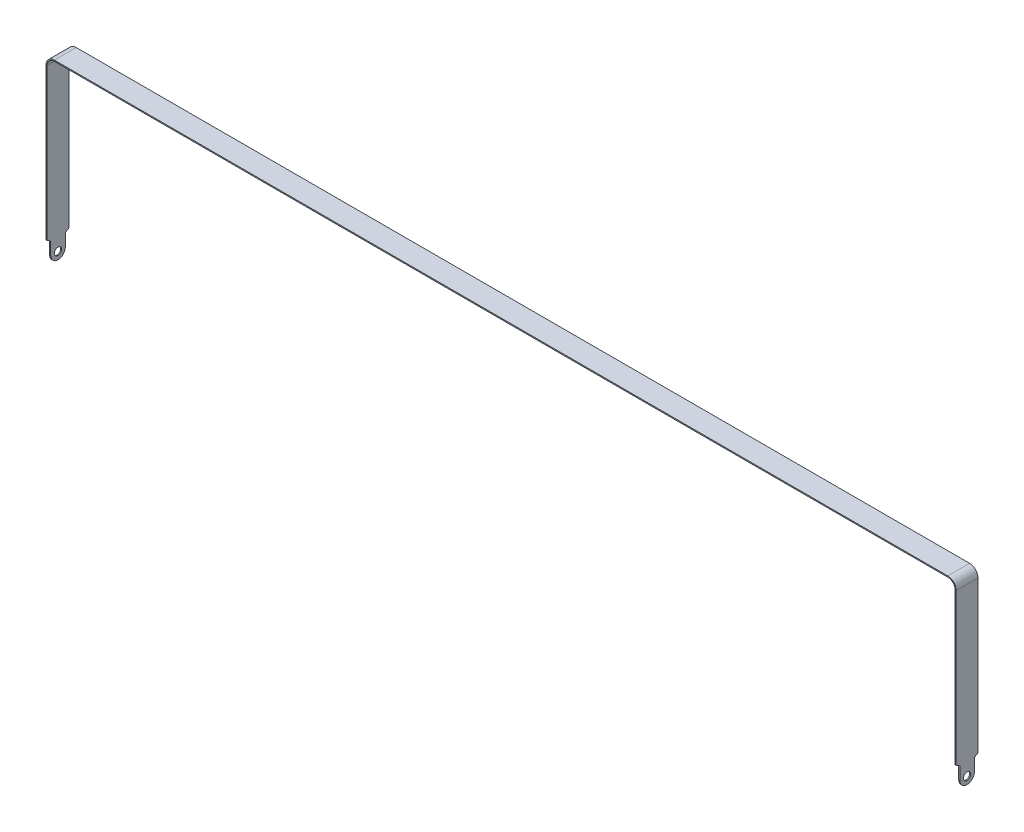
ISO-10303-21;
HEADER;
FILE_DESCRIPTION(('STEP AP214'),'2;1');
FILE_NAME('part.step','',(''),(''),'','','');
FILE_SCHEMA(('AUTOMOTIVE_DESIGN { 1 0 10303 214 1 1 1 1 }'));
ENDSEC;
DATA;
#1=APPLICATION_CONTEXT('core data for automotive mechanical design processes');
#2=APPLICATION_PROTOCOL_DEFINITION('international standard','automotive_design',2000,#1);
#3=PRODUCT_CONTEXT('',#1,'mechanical');
#4=PRODUCT('Part','Part','',(#3));
#5=PRODUCT_RELATED_PRODUCT_CATEGORY('part','',(#4));
#6=PRODUCT_DEFINITION_FORMATION('','',#4);
#7=PRODUCT_DEFINITION_CONTEXT('part definition',#1,'design');
#8=PRODUCT_DEFINITION('design','',#6,#7);
#9=PRODUCT_DEFINITION_SHAPE('','',#8);
#10=(LENGTH_UNIT() NAMED_UNIT(*) SI_UNIT(.MILLI.,.METRE.));
#11=(NAMED_UNIT(*) PLANE_ANGLE_UNIT() SI_UNIT($,.RADIAN.));
#12=(NAMED_UNIT(*) SI_UNIT($,.STERADIAN.) SOLID_ANGLE_UNIT());
#13=UNCERTAINTY_MEASURE_WITH_UNIT(LENGTH_MEASURE(1.E-05),#10,'distance_accuracy_value','');
#14=(GEOMETRIC_REPRESENTATION_CONTEXT(3) GLOBAL_UNCERTAINTY_ASSIGNED_CONTEXT((#13)) GLOBAL_UNIT_ASSIGNED_CONTEXT((#10,
#11,#12)) REPRESENTATION_CONTEXT('',''));
#15=CARTESIAN_POINT('',(0.,0.,0.));
#16=DIRECTION('',(0.,0.,1.));
#17=DIRECTION('',(1.,0.,0.));
#18=AXIS2_PLACEMENT_3D('',#15,#16,#17);
#19=CARTESIAN_POINT('',(0.,-0.75,0.));
#20=DIRECTION('',(0.,-1.,0.));
#21=DIRECTION('',(0.,0.,-1.));
#22=AXIS2_PLACEMENT_3D('',#19,#20,#21);
#23=PLANE('',#22);
#24=DIRECTION('',(1.,0.,0.));
#25=VECTOR('',#24,1.);
#26=CARTESIAN_POINT('',(-311.75,-0.75,7.5));
#27=LINE('',#26,#25);
#28=CARTESIAN_POINT('',(-306.75,-0.749999999999991,7.5));
#29=VERTEX_POINT('',#28);
#30=CARTESIAN_POINT('',(306.75,-0.75,7.5));
#31=VERTEX_POINT('',#30);
#32=EDGE_CURVE('E350',#29,#31,#27,.T.);
#33=ORIENTED_EDGE('',*,*,#32,.F.);
#34=DIRECTION('',(0.,0.,-1.));
#35=VECTOR('',#34,1.);
#36=CARTESIAN_POINT('',(-306.75,-0.749999999999991,-7.50000000000001));
#37=LINE('',#36,#35);
#38=CARTESIAN_POINT('',(-306.75,-0.749999999999991,-7.50000000000001));
#39=VERTEX_POINT('',#38);
#40=EDGE_CURVE('E292',#39,#29,#37,.F.);
#41=ORIENTED_EDGE('',*,*,#40,.F.);
#42=DIRECTION('',(-1.,0.,0.));
#43=VECTOR('',#42,1.);
#44=CARTESIAN_POINT('',(-311.75,-0.75,-7.5));
#45=LINE('',#44,#43);
#46=CARTESIAN_POINT('',(306.75,-0.75,-7.5));
#47=VERTEX_POINT('',#46);
#48=EDGE_CURVE('E347',#47,#39,#45,.T.);
#49=ORIENTED_EDGE('',*,*,#48,.F.);
#50=DIRECTION('',(0.,0.,1.));
#51=VECTOR('',#50,1.);
#52=CARTESIAN_POINT('',(306.75,-0.749999999999991,7.5));
#53=LINE('',#52,#51);
#54=EDGE_CURVE('E337',#31,#47,#53,.F.);
#55=ORIENTED_EDGE('',*,*,#54,.F.);
#56=EDGE_LOOP('',(#33,#41,#49,#55));
#57=FACE_BOUND('',#56,.T.);
#58=ADVANCED_FACE('F38',(#57),#23,.T.);
#59=CARTESIAN_POINT('',(0.,0.,0.));
#60=DIRECTION('',(0.,-1.,0.));
#61=DIRECTION('',(0.,0.,-1.));
#62=AXIS2_PLACEMENT_3D('',#59,#60,#61);
#63=PLANE('',#62);
#64=DIRECTION('',(0.,0.,-1.));
#65=VECTOR('',#64,1.);
#66=CARTESIAN_POINT('',(-306.75,0.,-7.50000000000001));
#67=LINE('',#66,#65);
#68=CARTESIAN_POINT('',(-306.75,0.,-7.50000000000001));
#69=VERTEX_POINT('',#68);
#70=CARTESIAN_POINT('',(-306.75,0.,7.5));
#71=VERTEX_POINT('',#70);
#72=EDGE_CURVE('E280',#69,#71,#67,.F.);
#73=ORIENTED_EDGE('',*,*,#72,.T.);
#74=DIRECTION('',(1.,0.,0.));
#75=VECTOR('',#74,1.);
#76=CARTESIAN_POINT('',(-311.75,0.,7.5));
#77=LINE('',#76,#75);
#78=CARTESIAN_POINT('',(306.75,0.,7.5));
#79=VERTEX_POINT('',#78);
#80=EDGE_CURVE('E351',#71,#79,#77,.T.);
#81=ORIENTED_EDGE('',*,*,#80,.T.);
#82=DIRECTION('',(0.,0.,1.));
#83=VECTOR('',#82,1.);
#84=CARTESIAN_POINT('',(306.75,0.,7.5));
#85=LINE('',#84,#83);
#86=CARTESIAN_POINT('',(306.75,0.,-7.5));
#87=VERTEX_POINT('',#86);
#88=EDGE_CURVE('E325',#79,#87,#85,.F.);
#89=ORIENTED_EDGE('',*,*,#88,.T.);
#90=DIRECTION('',(-1.,0.,0.));
#91=VECTOR('',#90,1.);
#92=CARTESIAN_POINT('',(-311.75,0.,-7.5));
#93=LINE('',#92,#91);
#94=EDGE_CURVE('E345',#87,#69,#93,.T.);
#95=ORIENTED_EDGE('',*,*,#94,.T.);
#96=EDGE_LOOP('',(#73,#81,#89,#95));
#97=FACE_BOUND('',#96,.T.);
#98=ADVANCED_FACE('F417',(#97),#63,.F.);
#99=CARTESIAN_POINT('',(-311.75,-0.75,-7.5));
#100=DIRECTION('',(0.,0.,-1.));
#101=DIRECTION('',(-1.,0.,0.));
#102=AXIS2_PLACEMENT_3D('',#99,#100,#101);
#103=PLANE('',#102);
#104=ORIENTED_EDGE('',*,*,#48,.T.);
#105=DIRECTION('',(0.,1.,0.));
#106=VECTOR('',#105,1.);
#107=CARTESIAN_POINT('',(-306.75,-0.749999999999991,-7.50000000000001));
#108=LINE('',#107,#106);
#109=EDGE_CURVE('E286',#39,#69,#108,.T.);
#110=ORIENTED_EDGE('',*,*,#109,.T.);
#111=ORIENTED_EDGE('',*,*,#94,.F.);
#112=DIRECTION('',(0.,1.,0.));
#113=VECTOR('',#112,1.);
#114=CARTESIAN_POINT('',(306.75,-0.749999999999991,-7.5));
#115=LINE('',#114,#113);
#116=EDGE_CURVE('E342',#47,#87,#115,.T.);
#117=ORIENTED_EDGE('',*,*,#116,.F.);
#118=EDGE_LOOP('',(#104,#110,#111,#117));
#119=FACE_BOUND('',#118,.T.);
#120=ADVANCED_FACE('F40',(#119),#103,.T.);
#121=CARTESIAN_POINT('',(-311.75,-0.75,7.5));
#122=DIRECTION('',(0.,0.,1.));
#123=DIRECTION('',(1.,0.,0.));
#124=AXIS2_PLACEMENT_3D('',#121,#122,#123);
#125=PLANE('',#124);
#126=DIRECTION('',(0.,1.,0.));
#127=VECTOR('',#126,1.);
#128=CARTESIAN_POINT('',(-306.75,-0.749999999999991,7.5));
#129=LINE('',#128,#127);
#130=EDGE_CURVE('E297',#29,#71,#129,.T.);
#131=ORIENTED_EDGE('',*,*,#130,.F.);
#132=ORIENTED_EDGE('',*,*,#32,.T.);
#133=DIRECTION('',(0.,1.,0.));
#134=VECTOR('',#133,1.);
#135=CARTESIAN_POINT('',(306.75,-0.749999999999991,7.5));
#136=LINE('',#135,#134);
#137=EDGE_CURVE('E331',#31,#79,#136,.T.);
#138=ORIENTED_EDGE('',*,*,#137,.T.);
#139=ORIENTED_EDGE('',*,*,#80,.F.);
#140=EDGE_LOOP('',(#131,#132,#138,#139));
#141=FACE_BOUND('',#140,.T.);
#142=ADVANCED_FACE('F400',(#141),#125,.T.);
#143=CARTESIAN_POINT('',(306.75,-5.75,-7.5));
#144=DIRECTION('',(0.,0.,-1.));
#145=DIRECTION('',(-1.,0.,0.));
#146=AXIS2_PLACEMENT_3D('',#143,#144,#145);
#147=PLANE('',#146);
#148=DIRECTION('',(1.,0.,0.));
#149=VECTOR('',#148,1.);
#150=CARTESIAN_POINT('',(311.75,-5.74999999999998,-7.49999999999999));
#151=LINE('',#150,#149);
#152=CARTESIAN_POINT('',(311.75,-5.74999999999998,-7.5));
#153=VERTEX_POINT('',#152);
#154=CARTESIAN_POINT('',(312.5,-5.74999999999998,-7.5));
#155=VERTEX_POINT('',#154);
#156=EDGE_CURVE('E300',#153,#155,#151,.T.);
#157=ORIENTED_EDGE('',*,*,#156,.F.);
#158=CARTESIAN_POINT('',(306.75,-5.75,-7.5));
#159=DIRECTION('',(0.,0.,1.));
#160=DIRECTION('',(1.,0.,0.));
#161=AXIS2_PLACEMENT_3D('',#158,#159,#160);
#162=CIRCLE('',#161,5.);
#163=EDGE_CURVE('E334',#47,#153,#162,.F.);
#164=ORIENTED_EDGE('',*,*,#163,.F.);
#165=ORIENTED_EDGE('',*,*,#116,.T.);
#166=CARTESIAN_POINT('',(306.75,-5.75,-7.5));
#167=DIRECTION('',(0.,0.,1.));
#168=DIRECTION('',(1.,0.,0.));
#169=AXIS2_PLACEMENT_3D('',#166,#167,#168);
#170=CIRCLE('',#169,5.75);
#171=EDGE_CURVE('E327',#87,#155,#170,.F.);
#172=ORIENTED_EDGE('',*,*,#171,.T.);
#173=EDGE_LOOP('',(#157,#164,#165,#172));
#174=FACE_BOUND('',#173,.T.);
#175=ADVANCED_FACE('F428',(#174),#147,.T.);
#176=CARTESIAN_POINT('',(306.75,-5.75,7.5));
#177=DIRECTION('',(0.,0.,-1.));
#178=DIRECTION('',(-1.,0.,0.));
#179=AXIS2_PLACEMENT_3D('',#176,#177,#178);
#180=PLANE('',#179);
#181=CARTESIAN_POINT('',(306.75,-5.75,7.5));
#182=DIRECTION('',(0.,0.,1.));
#183=DIRECTION('',(1.,0.,0.));
#184=AXIS2_PLACEMENT_3D('',#181,#182,#183);
#185=CIRCLE('',#184,5.);
#186=CARTESIAN_POINT('',(311.75,-5.74999999999998,7.5));
#187=VERTEX_POINT('',#186);
#188=EDGE_CURVE('E321',#187,#31,#185,.T.);
#189=ORIENTED_EDGE('',*,*,#188,.F.);
#190=DIRECTION('',(1.,0.,0.));
#191=VECTOR('',#190,1.);
#192=CARTESIAN_POINT('',(311.75,-5.74999999999998,7.5));
#193=LINE('',#192,#191);
#194=CARTESIAN_POINT('',(312.5,-5.74999999999997,7.5));
#195=VERTEX_POINT('',#194);
#196=EDGE_CURVE('E306',#187,#195,#193,.T.);
#197=ORIENTED_EDGE('',*,*,#196,.T.);
#198=CARTESIAN_POINT('',(306.75,-5.75,7.5));
#199=DIRECTION('',(0.,0.,1.));
#200=DIRECTION('',(1.,0.,0.));
#201=AXIS2_PLACEMENT_3D('',#198,#199,#200);
#202=CIRCLE('',#201,5.75);
#203=EDGE_CURVE('E328',#195,#79,#202,.T.);
#204=ORIENTED_EDGE('',*,*,#203,.T.);
#205=ORIENTED_EDGE('',*,*,#137,.F.);
#206=EDGE_LOOP('',(#189,#197,#204,#205));
#207=FACE_BOUND('',#206,.T.);
#208=ADVANCED_FACE('F425',(#207),#180,.F.);
#209=CARTESIAN_POINT('',(306.75,-5.75,7.5));
#210=DIRECTION('',(0.,0.,1.));
#211=DIRECTION('',(1.,0.,0.));
#212=AXIS2_PLACEMENT_3D('',#209,#210,#211);
#213=CYLINDRICAL_SURFACE('',#212,5.75);
#214=ORIENTED_EDGE('',*,*,#88,.F.);
#215=ORIENTED_EDGE('',*,*,#203,.F.);
#216=DIRECTION('',(0.,0.,1.));
#217=VECTOR('',#216,1.);
#218=CARTESIAN_POINT('',(312.5,-5.74999999999998,0.));
#219=LINE('',#218,#217);
#220=EDGE_CURVE('E309',#155,#195,#219,.T.);
#221=ORIENTED_EDGE('',*,*,#220,.F.);
#222=ORIENTED_EDGE('',*,*,#171,.F.);
#223=EDGE_LOOP('',(#214,#215,#221,#222));
#224=FACE_BOUND('',#223,.T.);
#225=ADVANCED_FACE('F468',(#224),#213,.T.);
#226=CARTESIAN_POINT('',(306.75,-5.75,7.5));
#227=DIRECTION('',(0.,0.,1.));
#228=DIRECTION('',(1.,0.,0.));
#229=AXIS2_PLACEMENT_3D('',#226,#227,#228);
#230=CYLINDRICAL_SURFACE('',#229,5.);
#231=ORIENTED_EDGE('',*,*,#54,.T.);
#232=ORIENTED_EDGE('',*,*,#163,.T.);
#233=DIRECTION('',(0.,0.,1.));
#234=VECTOR('',#233,1.);
#235=CARTESIAN_POINT('',(311.75,-5.74999999999998,-7.49999999999999));
#236=LINE('',#235,#234);
#237=EDGE_CURVE('E303',#153,#187,#236,.T.);
#238=ORIENTED_EDGE('',*,*,#237,.T.);
#239=ORIENTED_EDGE('',*,*,#188,.T.);
#240=EDGE_LOOP('',(#231,#232,#238,#239));
#241=FACE_BOUND('',#240,.T.);
#242=ADVANCED_FACE('F440',(#241),#230,.F.);
#243=CARTESIAN_POINT('',(312.5,-0.749999999999997,7.5));
#244=DIRECTION('',(0.,0.,1.));
#245=DIRECTION('',(1.,0.,0.));
#246=AXIS2_PLACEMENT_3D('',#243,#244,#245);
#247=PLANE('',#246);
#248=DIRECTION('',(-1.,0.,0.));
#249=VECTOR('',#248,1.);
#250=CARTESIAN_POINT('',(312.5,-109.82509246915,7.5));
#251=LINE('',#250,#249);
#252=CARTESIAN_POINT('',(312.5,-109.82509246915,7.5));
#253=VERTEX_POINT('',#252);
#254=CARTESIAN_POINT('',(311.75,-109.82509246915,7.50000000000001));
#255=VERTEX_POINT('',#254);
#256=EDGE_CURVE('E257',#253,#255,#251,.T.);
#257=ORIENTED_EDGE('',*,*,#256,.F.);
#258=DIRECTION('',(0.,1.,0.));
#259=VECTOR('',#258,1.);
#260=CARTESIAN_POINT('',(312.5,-0.749999999999997,7.5));
#261=LINE('',#260,#259);
#262=EDGE_CURVE('E318',#253,#195,#261,.T.);
#263=ORIENTED_EDGE('',*,*,#262,.T.);
#264=ORIENTED_EDGE('',*,*,#196,.F.);
#265=DIRECTION('',(0.,1.,0.));
#266=VECTOR('',#265,1.);
#267=CARTESIAN_POINT('',(311.75,-0.75,7.5));
#268=LINE('',#267,#266);
#269=EDGE_CURVE('E319',#255,#187,#268,.T.);
#270=ORIENTED_EDGE('',*,*,#269,.F.);
#271=EDGE_LOOP('',(#257,#263,#264,#270));
#272=FACE_BOUND('',#271,.T.);
#273=ADVANCED_FACE('F464',(#272),#247,.T.);
#274=CARTESIAN_POINT('',(312.5,-125.,-7.49999999999998));
#275=DIRECTION('',(0.,0.,-1.));
#276=DIRECTION('',(0.,1.,0.));
#277=AXIS2_PLACEMENT_3D('',#274,#275,#276);
#278=PLANE('',#277);
#279=DIRECTION('',(1.,0.,0.));
#280=VECTOR('',#279,1.);
#281=CARTESIAN_POINT('',(312.5,-109.82509246915,-7.49999999999998));
#282=LINE('',#281,#280);
#283=CARTESIAN_POINT('',(311.75,-109.82509246915,-7.49999999999999));
#284=VERTEX_POINT('',#283);
#285=CARTESIAN_POINT('',(312.5,-109.82509246915,-7.49999999999998));
#286=VERTEX_POINT('',#285);
#287=EDGE_CURVE('E244',#284,#286,#282,.T.);
#288=ORIENTED_EDGE('',*,*,#287,.F.);
#289=DIRECTION('',(0.,-1.,0.));
#290=VECTOR('',#289,1.);
#291=CARTESIAN_POINT('',(311.75,-125.,-7.49999999999998));
#292=LINE('',#291,#290);
#293=EDGE_CURVE('E314',#153,#284,#292,.T.);
#294=ORIENTED_EDGE('',*,*,#293,.F.);
#295=ORIENTED_EDGE('',*,*,#156,.T.);
#296=DIRECTION('',(0.,-1.,0.));
#297=VECTOR('',#296,1.);
#298=CARTESIAN_POINT('',(312.5,-125.,-7.49999999999998));
#299=LINE('',#298,#297);
#300=EDGE_CURVE('E315',#155,#286,#299,.T.);
#301=ORIENTED_EDGE('',*,*,#300,.T.);
#302=EDGE_LOOP('',(#288,#294,#295,#301));
#303=FACE_BOUND('',#302,.T.);
#304=ADVANCED_FACE('F448',(#303),#278,.T.);
#305=CARTESIAN_POINT('',(312.5,1.1168625640887E-12,0.));
#306=DIRECTION('',(1.,0.,0.));
#307=DIRECTION('',(0.,1.,0.));
#308=AXIS2_PLACEMENT_3D('',#305,#306,#307);
#309=PLANE('',#308);
#310=DIRECTION('',(0.,0.504602938883446,0.863351535627399));
#311=VECTOR('',#310,1.);
#312=CARTESIAN_POINT('',(312.5,-111.286267083604,5.));
#313=LINE('',#312,#311);
#314=CARTESIAN_POINT('',(312.5,-111.286267083604,5.));
#315=VERTEX_POINT('',#314);
#316=EDGE_CURVE('E196',#315,#253,#313,.T.);
#317=ORIENTED_EDGE('',*,*,#316,.F.);
#318=DIRECTION('',(0.,1.,0.));
#319=VECTOR('',#318,1.);
#320=CARTESIAN_POINT('',(312.5,-111.286267083604,5.));
#321=LINE('',#320,#319);
#322=CARTESIAN_POINT('',(312.5,-120.,5.));
#323=VERTEX_POINT('',#322);
#324=EDGE_CURVE('E198',#323,#315,#321,.T.);
#325=ORIENTED_EDGE('',*,*,#324,.F.);
#326=CARTESIAN_POINT('',(312.5,-120.,0.));
#327=DIRECTION('',(-1.,0.,0.));
#328=DIRECTION('',(0.,1.,0.));
#329=AXIS2_PLACEMENT_3D('',#326,#327,#328);
#330=CIRCLE('',#329,5.);
#331=CARTESIAN_POINT('',(312.5,-120.,-5.));
#332=VERTEX_POINT('',#331);
#333=EDGE_CURVE('E212',#332,#323,#330,.T.);
#334=ORIENTED_EDGE('',*,*,#333,.F.);
#335=DIRECTION('',(0.,-1.,0.));
#336=VECTOR('',#335,1.);
#337=CARTESIAN_POINT('',(312.5,-120.,-5.));
#338=LINE('',#337,#336);
#339=CARTESIAN_POINT('',(312.5,-111.286267083604,-5.));
#340=VERTEX_POINT('',#339);
#341=EDGE_CURVE('E209',#340,#332,#338,.T.);
#342=ORIENTED_EDGE('',*,*,#341,.F.);
#343=DIRECTION('',(0.,-0.504602938883446,0.863351535627399));
#344=VECTOR('',#343,1.);
#345=CARTESIAN_POINT('',(312.5,-111.286267083604,-5.));
#346=LINE('',#345,#344);
#347=EDGE_CURVE('E207',#286,#340,#346,.T.);
#348=ORIENTED_EDGE('',*,*,#347,.F.);
#349=ORIENTED_EDGE('',*,*,#300,.F.);
#350=ORIENTED_EDGE('',*,*,#220,.T.);
#351=ORIENTED_EDGE('',*,*,#262,.F.);
#352=EDGE_LOOP('',(#317,#325,#334,#342,#348,#349,#350,#351));
#353=FACE_BOUND('',#352,.T.);
#354=CARTESIAN_POINT('',(312.5,-120.,0.));
#355=DIRECTION('',(1.,0.,0.));
#356=DIRECTION('',(0.,1.,0.));
#357=AXIS2_PLACEMENT_3D('',#354,#355,#356);
#358=CIRCLE('',#357,2.5);
#359=CARTESIAN_POINT('',(312.5,-117.5,0.));
#360=VERTEX_POINT('',#359);
#361=EDGE_CURVE('E220',#360,#360,#358,.T.);
#362=ORIENTED_EDGE('',*,*,#361,.F.);
#363=EDGE_LOOP('',(#362));
#364=FACE_BOUND('',#363,.T.);
#365=ADVANCED_FACE('F452',(#353,#364),#309,.T.);
#366=CARTESIAN_POINT('',(311.75,1.11424395308456E-12,0.));
#367=DIRECTION('',(1.,0.,0.));
#368=DIRECTION('',(0.,1.,0.));
#369=AXIS2_PLACEMENT_3D('',#366,#367,#368);
#370=PLANE('',#369);
#371=CARTESIAN_POINT('',(311.75,-120.,0.));
#372=DIRECTION('',(1.,0.,0.));
#373=DIRECTION('',(0.,1.,0.));
#374=AXIS2_PLACEMENT_3D('',#371,#372,#373);
#375=CIRCLE('',#374,2.5);
#376=CARTESIAN_POINT('',(311.75,-117.5,0.));
#377=VERTEX_POINT('',#376);
#378=EDGE_CURVE('E237',#377,#377,#375,.T.);
#379=ORIENTED_EDGE('',*,*,#378,.T.);
#380=EDGE_LOOP('',(#379));
#381=FACE_BOUND('',#380,.T.);
#382=DIRECTION('',(0.,1.,0.));
#383=VECTOR('',#382,1.);
#384=CARTESIAN_POINT('',(311.75,1.11474165122743E-12,4.99999999999999));
#385=LINE('',#384,#383);
#386=CARTESIAN_POINT('',(311.75,-120.,5.));
#387=VERTEX_POINT('',#386);
#388=CARTESIAN_POINT('',(311.75,-111.286267083604,5.));
#389=VERTEX_POINT('',#388);
#390=EDGE_CURVE('E249',#387,#389,#385,.T.);
#391=ORIENTED_EDGE('',*,*,#390,.T.);
#392=DIRECTION('',(0.,0.504602938883446,0.8633515356274));
#393=VECTOR('',#392,1.);
#394=CARTESIAN_POINT('',(311.75,-85.1283472102854,49.7549519656379));
#395=LINE('',#394,#393);
#396=EDGE_CURVE('E254',#389,#255,#395,.T.);
#397=ORIENTED_EDGE('',*,*,#396,.T.);
#398=ORIENTED_EDGE('',*,*,#269,.T.);
#399=ORIENTED_EDGE('',*,*,#237,.F.);
#400=ORIENTED_EDGE('',*,*,#293,.T.);
#401=DIRECTION('',(0.,-0.504602938883446,0.8633515356274));
#402=VECTOR('',#401,1.);
#403=CARTESIAN_POINT('',(311.75,-85.1283472102854,-49.7549519656379));
#404=LINE('',#403,#402);
#405=CARTESIAN_POINT('',(311.75,-111.286267083604,-5.));
#406=VERTEX_POINT('',#405);
#407=EDGE_CURVE('E241',#284,#406,#404,.T.);
#408=ORIENTED_EDGE('',*,*,#407,.T.);
#409=DIRECTION('',(0.,-1.,0.));
#410=VECTOR('',#409,1.);
#411=CARTESIAN_POINT('',(311.75,1.11474165122743E-12,-4.99999999999999));
#412=LINE('',#411,#410);
#413=CARTESIAN_POINT('',(311.75,-120.,-5.));
#414=VERTEX_POINT('',#413);
#415=EDGE_CURVE('E246',#406,#414,#412,.T.);
#416=ORIENTED_EDGE('',*,*,#415,.T.);
#417=CARTESIAN_POINT('',(311.75,-120.,0.));
#418=DIRECTION('',(1.,0.,0.));
#419=DIRECTION('',(0.,1.,0.));
#420=AXIS2_PLACEMENT_3D('',#417,#418,#419);
#421=CIRCLE('',#420,5.);
#422=EDGE_CURVE('E234',#414,#387,#421,.F.);
#423=ORIENTED_EDGE('',*,*,#422,.T.);
#424=EDGE_LOOP('',(#391,#397,#398,#399,#400,#408,#416,#423));
#425=FACE_BOUND('',#424,.T.);
#426=ADVANCED_FACE('F458',(#381,#425),#370,.F.);
#427=CARTESIAN_POINT('',(-306.75,-5.75,7.5));
#428=DIRECTION('',(0.,0.,1.));
#429=DIRECTION('',(1.,0.,0.));
#430=AXIS2_PLACEMENT_3D('',#427,#428,#429);
#431=PLANE('',#430);
#432=DIRECTION('',(-1.,0.,0.));
#433=VECTOR('',#432,1.);
#434=CARTESIAN_POINT('',(-311.75,-5.74999999999998,7.5));
#435=LINE('',#434,#433);
#436=CARTESIAN_POINT('',(-311.75,-5.74999999999998,7.5));
#437=VERTEX_POINT('',#436);
#438=CARTESIAN_POINT('',(-312.5,-5.74999999999998,7.5));
#439=VERTEX_POINT('',#438);
#440=EDGE_CURVE('E259',#437,#439,#435,.T.);
#441=ORIENTED_EDGE('',*,*,#440,.F.);
#442=CARTESIAN_POINT('',(-306.75,-5.75,7.5));
#443=DIRECTION('',(0.,0.,-1.));
#444=DIRECTION('',(-1.,0.,0.));
#445=AXIS2_PLACEMENT_3D('',#442,#443,#444);
#446=CIRCLE('',#445,5.);
#447=EDGE_CURVE('E289',#29,#437,#446,.F.);
#448=ORIENTED_EDGE('',*,*,#447,.F.);
#449=ORIENTED_EDGE('',*,*,#130,.T.);
#450=CARTESIAN_POINT('',(-306.75,-5.75,7.5));
#451=DIRECTION('',(0.,0.,-1.));
#452=DIRECTION('',(-1.,0.,0.));
#453=AXIS2_PLACEMENT_3D('',#450,#451,#452);
#454=CIRCLE('',#453,5.75);
#455=EDGE_CURVE('E282',#71,#439,#454,.F.);
#456=ORIENTED_EDGE('',*,*,#455,.T.);
#457=EDGE_LOOP('',(#441,#448,#449,#456));
#458=FACE_BOUND('',#457,.T.);
#459=ADVANCED_FACE('F395',(#458),#431,.T.);
#460=CARTESIAN_POINT('',(-306.75,-5.75,-7.50000000000001));
#461=DIRECTION('',(0.,0.,1.));
#462=DIRECTION('',(1.,0.,0.));
#463=AXIS2_PLACEMENT_3D('',#460,#461,#462);
#464=PLANE('',#463);
#465=CARTESIAN_POINT('',(-306.75,-5.75,-7.50000000000001));
#466=DIRECTION('',(0.,0.,-1.));
#467=DIRECTION('',(-1.,0.,0.));
#468=AXIS2_PLACEMENT_3D('',#465,#466,#467);
#469=CIRCLE('',#468,5.);
#470=CARTESIAN_POINT('',(-311.75,-5.74999999999998,-7.50000000000001));
#471=VERTEX_POINT('',#470);
#472=EDGE_CURVE('E276',#471,#39,#469,.T.);
#473=ORIENTED_EDGE('',*,*,#472,.F.);
#474=DIRECTION('',(-1.,0.,0.));
#475=VECTOR('',#474,1.);
#476=CARTESIAN_POINT('',(-311.75,-5.74999999999998,-7.50000000000001));
#477=LINE('',#476,#475);
#478=CARTESIAN_POINT('',(-312.5,-5.74999999999998,-7.50000000000001));
#479=VERTEX_POINT('',#478);
#480=EDGE_CURVE('E263',#471,#479,#477,.T.);
#481=ORIENTED_EDGE('',*,*,#480,.T.);
#482=CARTESIAN_POINT('',(-306.75,-5.75,-7.50000000000001));
#483=DIRECTION('',(0.,0.,-1.));
#484=DIRECTION('',(-1.,0.,0.));
#485=AXIS2_PLACEMENT_3D('',#482,#483,#484);
#486=CIRCLE('',#485,5.75);
#487=EDGE_CURVE('E283',#479,#69,#486,.T.);
#488=ORIENTED_EDGE('',*,*,#487,.T.);
#489=ORIENTED_EDGE('',*,*,#109,.F.);
#490=EDGE_LOOP('',(#473,#481,#488,#489));
#491=FACE_BOUND('',#490,.T.);
#492=ADVANCED_FACE('F388',(#491),#464,.F.);
#493=CARTESIAN_POINT('',(-306.75,-5.75,-7.50000000000001));
#494=DIRECTION('',(0.,0.,-1.));
#495=DIRECTION('',(-1.,0.,0.));
#496=AXIS2_PLACEMENT_3D('',#493,#494,#495);
#497=CYLINDRICAL_SURFACE('',#496,5.75);
#498=ORIENTED_EDGE('',*,*,#72,.F.);
#499=ORIENTED_EDGE('',*,*,#487,.F.);
#500=DIRECTION('',(0.,0.,1.));
#501=VECTOR('',#500,1.);
#502=CARTESIAN_POINT('',(-312.5,-5.74999999999998,0.));
#503=LINE('',#502,#501);
#504=EDGE_CURVE('E266',#479,#439,#503,.T.);
#505=ORIENTED_EDGE('',*,*,#504,.T.);
#506=ORIENTED_EDGE('',*,*,#455,.F.);
#507=EDGE_LOOP('',(#498,#499,#505,#506));
#508=FACE_BOUND('',#507,.T.);
#509=ADVANCED_FACE('F393',(#508),#497,.T.);
#510=CARTESIAN_POINT('',(-306.75,-5.75,-7.50000000000001));
#511=DIRECTION('',(0.,0.,-1.));
#512=DIRECTION('',(-1.,0.,0.));
#513=AXIS2_PLACEMENT_3D('',#510,#511,#512);
#514=CYLINDRICAL_SURFACE('',#513,5.);
#515=ORIENTED_EDGE('',*,*,#40,.T.);
#516=ORIENTED_EDGE('',*,*,#447,.T.);
#517=DIRECTION('',(0.,0.,-1.));
#518=VECTOR('',#517,1.);
#519=CARTESIAN_POINT('',(-311.75,-5.74999999999998,7.5));
#520=LINE('',#519,#518);
#521=EDGE_CURVE('E260',#437,#471,#520,.T.);
#522=ORIENTED_EDGE('',*,*,#521,.T.);
#523=ORIENTED_EDGE('',*,*,#472,.T.);
#524=EDGE_LOOP('',(#515,#516,#522,#523));
#525=FACE_BOUND('',#524,.T.);
#526=ADVANCED_FACE('F406',(#525),#514,.F.);
#527=CARTESIAN_POINT('',(-312.5,-0.749999999999997,7.5));
#528=DIRECTION('',(0.,0.,1.));
#529=DIRECTION('',(1.,0.,0.));
#530=AXIS2_PLACEMENT_3D('',#527,#528,#529);
#531=PLANE('',#530);
#532=DIRECTION('',(-1.,0.,0.));
#533=VECTOR('',#532,1.);
#534=CARTESIAN_POINT('',(-312.5,-109.825092469153,7.5));
#535=LINE('',#534,#533);
#536=CARTESIAN_POINT('',(-311.75,-109.825092469153,7.5));
#537=VERTEX_POINT('',#536);
#538=CARTESIAN_POINT('',(-312.500000000001,-109.825092469153,7.49999999999999));
#539=VERTEX_POINT('',#538);
#540=EDGE_CURVE('E252',#537,#539,#535,.T.);
#541=ORIENTED_EDGE('',*,*,#540,.F.);
#542=DIRECTION('',(0.,-1.,0.));
#543=VECTOR('',#542,1.);
#544=CARTESIAN_POINT('',(-311.75,-0.75,7.5));
#545=LINE('',#544,#543);
#546=EDGE_CURVE('E270',#437,#537,#545,.T.);
#547=ORIENTED_EDGE('',*,*,#546,.F.);
#548=ORIENTED_EDGE('',*,*,#440,.T.);
#549=DIRECTION('',(0.,-1.,0.));
#550=VECTOR('',#549,1.);
#551=CARTESIAN_POINT('',(-312.5,-0.749999999999997,7.5));
#552=LINE('',#551,#550);
#553=EDGE_CURVE('E271',#439,#539,#552,.T.);
#554=ORIENTED_EDGE('',*,*,#553,.T.);
#555=EDGE_LOOP('',(#541,#547,#548,#554));
#556=FACE_BOUND('',#555,.T.);
#557=ADVANCED_FACE('F377',(#556),#531,.T.);
#558=CARTESIAN_POINT('',(-312.5,-125.,-7.50000000000001));
#559=DIRECTION('',(0.,0.,-1.));
#560=DIRECTION('',(0.,1.,0.));
#561=AXIS2_PLACEMENT_3D('',#558,#559,#560);
#562=PLANE('',#561);
#563=DIRECTION('',(1.,0.,0.));
#564=VECTOR('',#563,1.);
#565=CARTESIAN_POINT('',(-312.500000000001,-109.825092469153,-7.50000000000001));
#566=LINE('',#565,#564);
#567=CARTESIAN_POINT('',(-312.500000000001,-109.825092469153,-7.50000000000001));
#568=VERTEX_POINT('',#567);
#569=CARTESIAN_POINT('',(-311.75,-109.825092469153,-7.50000000000001));
#570=VERTEX_POINT('',#569);
#571=EDGE_CURVE('E61',#568,#570,#566,.T.);
#572=ORIENTED_EDGE('',*,*,#571,.F.);
#573=DIRECTION('',(0.,1.,0.));
#574=VECTOR('',#573,1.);
#575=CARTESIAN_POINT('',(-312.5,-125.,-7.50000000000001));
#576=LINE('',#575,#574);
#577=EDGE_CURVE('E195',#568,#479,#576,.T.);
#578=ORIENTED_EDGE('',*,*,#577,.T.);
#579=ORIENTED_EDGE('',*,*,#480,.F.);
#580=DIRECTION('',(0.,1.,0.));
#581=VECTOR('',#580,1.);
#582=CARTESIAN_POINT('',(-311.75,-125.,-7.50000000000001));
#583=LINE('',#582,#581);
#584=EDGE_CURVE('E274',#570,#471,#583,.T.);
#585=ORIENTED_EDGE('',*,*,#584,.F.);
#586=EDGE_LOOP('',(#572,#578,#579,#585));
#587=FACE_BOUND('',#586,.T.);
#588=ADVANCED_FACE('F384',(#587),#562,.T.);
#589=CARTESIAN_POINT('',(-312.5,1.1168625640887E-12,0.));
#590=DIRECTION('',(1.,0.,0.));
#591=DIRECTION('',(0.,1.,0.));
#592=AXIS2_PLACEMENT_3D('',#589,#590,#591);
#593=PLANE('',#592);
#594=CARTESIAN_POINT('',(-312.5,-120.000000000002,0.));
#595=DIRECTION('',(1.,0.,0.));
#596=DIRECTION('',(0.,1.,0.));
#597=AXIS2_PLACEMENT_3D('',#594,#595,#596);
#598=CIRCLE('',#597,2.5);
#599=CARTESIAN_POINT('',(-312.5,-117.500000000002,0.));
#600=VERTEX_POINT('',#599);
#601=EDGE_CURVE('E227',#600,#600,#598,.T.);
#602=ORIENTED_EDGE('',*,*,#601,.T.);
#603=EDGE_LOOP('',(#602));
#604=FACE_BOUND('',#603,.T.);
#605=DIRECTION('',(0.,1.,0.));
#606=VECTOR('',#605,1.);
#607=CARTESIAN_POINT('',(-312.500000000001,-111.286267083607,5.));
#608=LINE('',#607,#606);
#609=CARTESIAN_POINT('',(-312.5,-120.000000000002,5.));
#610=VERTEX_POINT('',#609);
#611=CARTESIAN_POINT('',(-312.500000000001,-111.286267083607,5.));
#612=VERTEX_POINT('',#611);
#613=EDGE_CURVE('E202',#610,#612,#608,.T.);
#614=ORIENTED_EDGE('',*,*,#613,.T.);
#615=DIRECTION('',(0.,0.504602938883446,0.863351535627399));
#616=VECTOR('',#615,1.);
#617=CARTESIAN_POINT('',(-312.500000000001,-111.286267083607,5.));
#618=LINE('',#617,#616);
#619=EDGE_CURVE('E204',#612,#539,#618,.T.);
#620=ORIENTED_EDGE('',*,*,#619,.T.);
#621=ORIENTED_EDGE('',*,*,#553,.F.);
#622=ORIENTED_EDGE('',*,*,#504,.F.);
#623=ORIENTED_EDGE('',*,*,#577,.F.);
#624=DIRECTION('',(0.,-0.504602938883446,0.863351535627399));
#625=VECTOR('',#624,1.);
#626=CARTESIAN_POINT('',(-312.500000000001,-111.286267083607,-5.));
#627=LINE('',#626,#625);
#628=CARTESIAN_POINT('',(-312.500000000001,-111.286267083607,-5.));
#629=VERTEX_POINT('',#628);
#630=EDGE_CURVE('E176',#568,#629,#627,.T.);
#631=ORIENTED_EDGE('',*,*,#630,.T.);
#632=DIRECTION('',(0.,-1.,0.));
#633=VECTOR('',#632,1.);
#634=CARTESIAN_POINT('',(-312.5,-120.000000000002,-5.));
#635=LINE('',#634,#633);
#636=CARTESIAN_POINT('',(-312.5,-120.000000000002,-5.));
#637=VERTEX_POINT('',#636);
#638=EDGE_CURVE('E183',#629,#637,#635,.T.);
#639=ORIENTED_EDGE('',*,*,#638,.T.);
#640=CARTESIAN_POINT('',(-312.5,-120.000000000002,0.));
#641=DIRECTION('',(-1.,0.,0.));
#642=DIRECTION('',(0.,1.,0.));
#643=AXIS2_PLACEMENT_3D('',#640,#641,#642);
#644=CIRCLE('',#643,5.);
#645=EDGE_CURVE('E189',#637,#610,#644,.T.);
#646=ORIENTED_EDGE('',*,*,#645,.T.);
#647=EDGE_LOOP('',(#614,#620,#621,#622,#623,#631,#639,#646));
#648=FACE_BOUND('',#647,.T.);
#649=ADVANCED_FACE('F193',(#604,#648),#593,.F.);
#650=CARTESIAN_POINT('',(-311.75,1.11424395308456E-12,0.));
#651=DIRECTION('',(1.,0.,0.));
#652=DIRECTION('',(0.,1.,0.));
#653=AXIS2_PLACEMENT_3D('',#650,#651,#652);
#654=PLANE('',#653);
#655=DIRECTION('',(0.,0.504602938883446,0.8633515356274));
#656=VECTOR('',#655,1.);
#657=CARTESIAN_POINT('',(-311.75,-85.128347210287,49.7549519656389));
#658=LINE('',#657,#656);
#659=CARTESIAN_POINT('',(-311.75,-111.286267083607,5.));
#660=VERTEX_POINT('',#659);
#661=EDGE_CURVE('E11',#660,#537,#658,.T.);
#662=ORIENTED_EDGE('',*,*,#661,.F.);
#663=DIRECTION('',(0.,1.,0.));
#664=VECTOR('',#663,1.);
#665=CARTESIAN_POINT('',(-311.75,1.11474165122743E-12,4.99999999999999));
#666=LINE('',#665,#664);
#667=CARTESIAN_POINT('',(-311.75,-120.000000000002,5.));
#668=VERTEX_POINT('',#667);
#669=EDGE_CURVE('E46',#668,#660,#666,.T.);
#670=ORIENTED_EDGE('',*,*,#669,.F.);
#671=CARTESIAN_POINT('',(-311.75,-120.000000000002,0.));
#672=DIRECTION('',(1.,0.,0.));
#673=DIRECTION('',(0.,1.,0.));
#674=AXIS2_PLACEMENT_3D('',#671,#672,#673);
#675=CIRCLE('',#674,5.);
#676=CARTESIAN_POINT('',(-311.75,-120.000000000002,-5.));
#677=VERTEX_POINT('',#676);
#678=EDGE_CURVE('E230',#677,#668,#675,.F.);
#679=ORIENTED_EDGE('',*,*,#678,.F.);
#680=DIRECTION('',(0.,-1.,0.));
#681=VECTOR('',#680,1.);
#682=CARTESIAN_POINT('',(-311.75,1.11474165122743E-12,-4.99999999999999));
#683=LINE('',#682,#681);
#684=CARTESIAN_POINT('',(-311.75,-111.286267083607,-5.));
#685=VERTEX_POINT('',#684);
#686=EDGE_CURVE('E359',#685,#677,#683,.T.);
#687=ORIENTED_EDGE('',*,*,#686,.F.);
#688=DIRECTION('',(0.,-0.504602938883446,0.8633515356274));
#689=VECTOR('',#688,1.);
#690=CARTESIAN_POINT('',(-311.75,-85.128347210287,-49.7549519656389));
#691=LINE('',#690,#689);
#692=EDGE_CURVE('E177',#570,#685,#691,.T.);
#693=ORIENTED_EDGE('',*,*,#692,.F.);
#694=ORIENTED_EDGE('',*,*,#584,.T.);
#695=ORIENTED_EDGE('',*,*,#521,.F.);
#696=ORIENTED_EDGE('',*,*,#546,.T.);
#697=EDGE_LOOP('',(#662,#670,#679,#687,#693,#694,#695,#696));
#698=FACE_BOUND('',#697,.T.);
#699=CARTESIAN_POINT('',(-311.75,-120.000000000002,0.));
#700=DIRECTION('',(1.,0.,0.));
#701=DIRECTION('',(0.,1.,0.));
#702=AXIS2_PLACEMENT_3D('',#699,#700,#701);
#703=CIRCLE('',#702,2.5);
#704=CARTESIAN_POINT('',(-311.75,-117.500000000002,0.));
#705=VERTEX_POINT('',#704);
#706=EDGE_CURVE('E236',#705,#705,#703,.T.);
#707=ORIENTED_EDGE('',*,*,#706,.F.);
#708=EDGE_LOOP('',(#707));
#709=FACE_BOUND('',#708,.T.);
#710=ADVANCED_FACE('F372',(#698,#709),#654,.T.);
#711=CARTESIAN_POINT('',(-312.5,-120.000000000002,0.));
#712=DIRECTION('',(1.,0.,0.));
#713=DIRECTION('',(0.,1.,0.));
#714=AXIS2_PLACEMENT_3D('',#711,#712,#713);
#715=CYLINDRICAL_SURFACE('',#714,2.5);
#716=ORIENTED_EDGE('',*,*,#706,.T.);
#717=EDGE_LOOP('',(#716));
#718=FACE_BOUND('',#717,.T.);
#719=ORIENTED_EDGE('',*,*,#601,.F.);
#720=EDGE_LOOP('',(#719));
#721=FACE_BOUND('',#720,.T.);
#722=ADVANCED_FACE('F569',(#718,#721),#715,.F.);
#723=CARTESIAN_POINT('',(-312.500000000001,-111.286267083607,-5.));
#724=DIRECTION('',(0.,0.8633515356274,0.504602938883446));
#725=DIRECTION('',(0.,-0.504602938883446,0.8633515356274));
#726=AXIS2_PLACEMENT_3D('',#723,#724,#725);
#727=PLANE('',#726);
#728=ORIENTED_EDGE('',*,*,#571,.T.);
#729=ORIENTED_EDGE('',*,*,#692,.T.);
#730=DIRECTION('',(1.,0.,0.));
#731=VECTOR('',#730,1.);
#732=CARTESIAN_POINT('',(-312.500000000001,-111.286267083607,-5.));
#733=LINE('',#732,#731);
#734=EDGE_CURVE('E172',#629,#685,#733,.T.);
#735=ORIENTED_EDGE('',*,*,#734,.F.);
#736=ORIENTED_EDGE('',*,*,#630,.F.);
#737=EDGE_LOOP('',(#728,#729,#735,#736));
#738=FACE_BOUND('',#737,.T.);
#739=ADVANCED_FACE('F174',(#738),#727,.F.);
#740=CARTESIAN_POINT('',(-312.5,-120.000000000002,-5.));
#741=DIRECTION('',(0.,0.,1.));
#742=DIRECTION('',(0.,-1.,0.));
#743=AXIS2_PLACEMENT_3D('',#740,#741,#742);
#744=PLANE('',#743);
#745=ORIENTED_EDGE('',*,*,#686,.T.);
#746=DIRECTION('',(1.,0.,0.));
#747=VECTOR('',#746,1.);
#748=CARTESIAN_POINT('',(-312.5,-120.000000000002,-5.));
#749=LINE('',#748,#747);
#750=EDGE_CURVE('E186',#637,#677,#749,.T.);
#751=ORIENTED_EDGE('',*,*,#750,.F.);
#752=ORIENTED_EDGE('',*,*,#638,.F.);
#753=ORIENTED_EDGE('',*,*,#734,.T.);
#754=EDGE_LOOP('',(#745,#751,#752,#753));
#755=FACE_BOUND('',#754,.T.);
#756=ADVANCED_FACE('F184',(#755),#744,.F.);
#757=CARTESIAN_POINT('',(-312.5,-120.000000000002,0.));
#758=DIRECTION('',(1.,0.,0.));
#759=DIRECTION('',(0.,1.,0.));
#760=AXIS2_PLACEMENT_3D('',#757,#758,#759);
#761=CYLINDRICAL_SURFACE('',#760,5.);
#762=ORIENTED_EDGE('',*,*,#678,.T.);
#763=DIRECTION('',(1.,0.,0.));
#764=VECTOR('',#763,1.);
#765=CARTESIAN_POINT('',(-312.5,-120.000000000002,5.));
#766=LINE('',#765,#764);
#767=EDGE_CURVE('E222',#610,#668,#766,.T.);
#768=ORIENTED_EDGE('',*,*,#767,.F.);
#769=ORIENTED_EDGE('',*,*,#645,.F.);
#770=ORIENTED_EDGE('',*,*,#750,.T.);
#771=EDGE_LOOP('',(#762,#768,#769,#770));
#772=FACE_BOUND('',#771,.T.);
#773=ADVANCED_FACE('F380',(#772),#761,.T.);
#774=CARTESIAN_POINT('',(-312.500000000001,-111.286267083607,5.));
#775=DIRECTION('',(0.,0.,-1.));
#776=DIRECTION('',(0.,1.,0.));
#777=AXIS2_PLACEMENT_3D('',#774,#775,#776);
#778=PLANE('',#777);
#779=ORIENTED_EDGE('',*,*,#669,.T.);
#780=DIRECTION('',(1.,0.,0.));
#781=VECTOR('',#780,1.);
#782=CARTESIAN_POINT('',(-312.500000000001,-111.286267083607,5.));
#783=LINE('',#782,#781);
#784=EDGE_CURVE('E217',#612,#660,#783,.T.);
#785=ORIENTED_EDGE('',*,*,#784,.F.);
#786=ORIENTED_EDGE('',*,*,#613,.F.);
#787=ORIENTED_EDGE('',*,*,#767,.T.);
#788=EDGE_LOOP('',(#779,#785,#786,#787));
#789=FACE_BOUND('',#788,.T.);
#790=ADVANCED_FACE('F362',(#789),#778,.F.);
#791=CARTESIAN_POINT('',(-312.500000000001,-111.286267083607,5.));
#792=DIRECTION('',(0.,0.8633515356274,-0.504602938883446));
#793=DIRECTION('',(0.,0.504602938883446,0.8633515356274));
#794=AXIS2_PLACEMENT_3D('',#791,#792,#793);
#795=PLANE('',#794);
#796=ORIENTED_EDGE('',*,*,#540,.T.);
#797=ORIENTED_EDGE('',*,*,#619,.F.);
#798=ORIENTED_EDGE('',*,*,#784,.T.);
#799=ORIENTED_EDGE('',*,*,#661,.T.);
#800=EDGE_LOOP('',(#796,#797,#798,#799));
#801=FACE_BOUND('',#800,.T.);
#802=ADVANCED_FACE('F370',(#801),#795,.F.);
#803=ORIENTED_EDGE('',*,*,#361,.T.);
#804=EDGE_LOOP('',(#803));
#805=FACE_BOUND('',#804,.T.);
#806=ORIENTED_EDGE('',*,*,#378,.F.);
#807=EDGE_LOOP('',(#806));
#808=FACE_BOUND('',#807,.T.);
#809=ADVANCED_FACE('F581',(#805,#808),#715,.F.);
#810=ORIENTED_EDGE('',*,*,#256,.T.);
#811=ORIENTED_EDGE('',*,*,#396,.F.);
#812=EDGE_CURVE('E221',#389,#315,#783,.T.);
#813=ORIENTED_EDGE('',*,*,#812,.T.);
#814=ORIENTED_EDGE('',*,*,#316,.T.);
#815=EDGE_LOOP('',(#810,#811,#813,#814));
#816=FACE_BOUND('',#815,.T.);
#817=ADVANCED_FACE('F630',(#816),#795,.F.);
#818=EDGE_CURVE('E225',#387,#323,#766,.T.);
#819=ORIENTED_EDGE('',*,*,#818,.T.);
#820=ORIENTED_EDGE('',*,*,#324,.T.);
#821=ORIENTED_EDGE('',*,*,#812,.F.);
#822=ORIENTED_EDGE('',*,*,#390,.F.);
#823=EDGE_LOOP('',(#819,#820,#821,#822));
#824=FACE_BOUND('',#823,.T.);
#825=ADVANCED_FACE('F620',(#824),#778,.F.);
#826=EDGE_CURVE('E53',#406,#340,#733,.T.);
#827=ORIENTED_EDGE('',*,*,#826,.T.);
#828=ORIENTED_EDGE('',*,*,#341,.T.);
#829=EDGE_CURVE('E180',#414,#332,#749,.T.);
#830=ORIENTED_EDGE('',*,*,#829,.F.);
#831=ORIENTED_EDGE('',*,*,#415,.F.);
#832=EDGE_LOOP('',(#827,#828,#830,#831));
#833=FACE_BOUND('',#832,.T.);
#834=ADVANCED_FACE('F600',(#833),#744,.F.);
#835=ORIENTED_EDGE('',*,*,#287,.T.);
#836=ORIENTED_EDGE('',*,*,#347,.T.);
#837=ORIENTED_EDGE('',*,*,#826,.F.);
#838=ORIENTED_EDGE('',*,*,#407,.F.);
#839=EDGE_LOOP('',(#835,#836,#837,#838));
#840=FACE_BOUND('',#839,.T.);
#841=ADVANCED_FACE('F456',(#840),#727,.F.);
#842=ORIENTED_EDGE('',*,*,#829,.T.);
#843=ORIENTED_EDGE('',*,*,#333,.T.);
#844=ORIENTED_EDGE('',*,*,#818,.F.);
#845=ORIENTED_EDGE('',*,*,#422,.F.);
#846=EDGE_LOOP('',(#842,#843,#844,#845));
#847=FACE_BOUND('',#846,.T.);
#848=ADVANCED_FACE('F611',(#847),#761,.T.);
#849=CLOSED_SHELL('',(#58,#98,#120,#142,#175,#208,#225,#242,#273,#304,#365,#426,#459,#492,#509,
#526,#557,#588,#649,#710,#722,#739,#756,#773,#790,#802,#809,#817,#825,#834,#841,#848));
#850=MANIFOLD_SOLID_BREP('B2',#849);
#851=ADVANCED_BREP_SHAPE_REPRESENTATION('',(#18,#850),#14);
#852=SHAPE_DEFINITION_REPRESENTATION(#9,#851);
ENDSEC;
END-ISO-10303-21;
